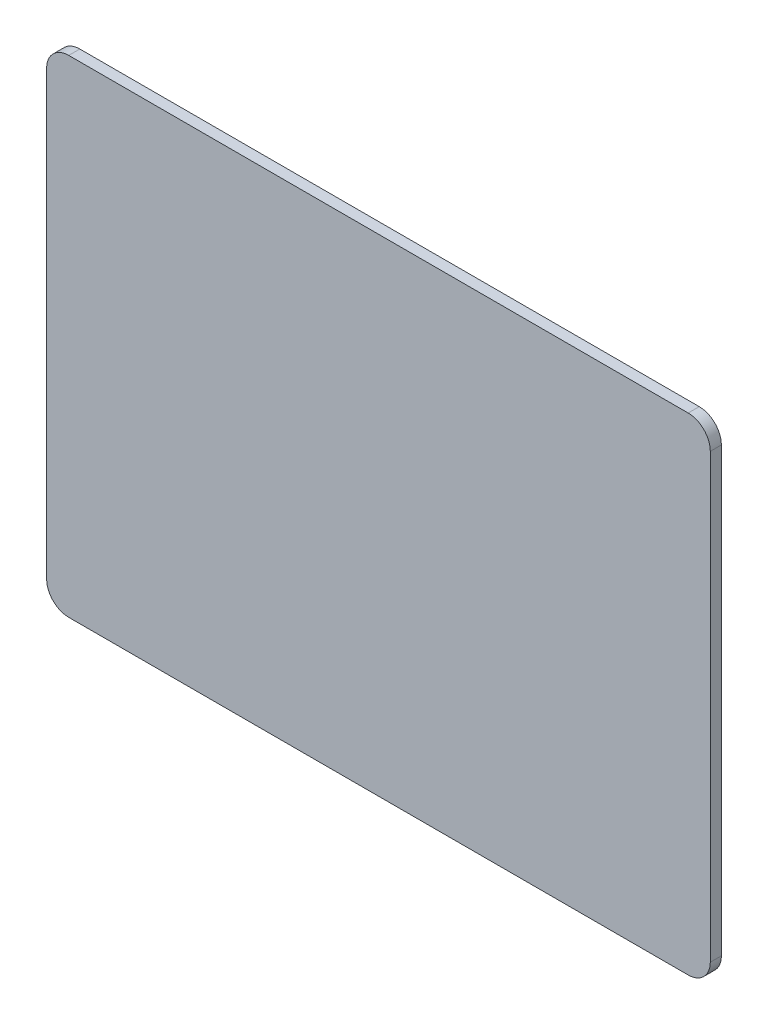
ISO-10303-21;
HEADER;
FILE_DESCRIPTION(('STEP AP214'),'2;1');
FILE_NAME('part.step','',(''),(''),'','','');
FILE_SCHEMA(('AUTOMOTIVE_DESIGN { 1 0 10303 214 1 1 1 1 }'));
ENDSEC;
DATA;
#1=APPLICATION_CONTEXT('core data for automotive mechanical design processes');
#2=APPLICATION_PROTOCOL_DEFINITION('international standard','automotive_design',2000,#1);
#3=PRODUCT_CONTEXT('',#1,'mechanical');
#4=PRODUCT('Part','Part','',(#3));
#5=PRODUCT_RELATED_PRODUCT_CATEGORY('part','',(#4));
#6=PRODUCT_DEFINITION_FORMATION('','',#4);
#7=PRODUCT_DEFINITION_CONTEXT('part definition',#1,'design');
#8=PRODUCT_DEFINITION('design','',#6,#7);
#9=PRODUCT_DEFINITION_SHAPE('','',#8);
#10=(LENGTH_UNIT() NAMED_UNIT(*) SI_UNIT(.MILLI.,.METRE.));
#11=(NAMED_UNIT(*) PLANE_ANGLE_UNIT() SI_UNIT($,.RADIAN.));
#12=(NAMED_UNIT(*) SI_UNIT($,.STERADIAN.) SOLID_ANGLE_UNIT());
#13=UNCERTAINTY_MEASURE_WITH_UNIT(LENGTH_MEASURE(1.E-05),#10,'distance_accuracy_value','');
#14=(GEOMETRIC_REPRESENTATION_CONTEXT(3) GLOBAL_UNCERTAINTY_ASSIGNED_CONTEXT((#13)) GLOBAL_UNIT_ASSIGNED_CONTEXT((#10,
#11,#12)) REPRESENTATION_CONTEXT('',''));
#15=CARTESIAN_POINT('',(0.,0.,0.));
#16=DIRECTION('',(0.,0.,1.));
#17=DIRECTION('',(1.,0.,0.));
#18=AXIS2_PLACEMENT_3D('',#15,#16,#17);
#19=CARTESIAN_POINT('',(-290.,100.,5.));
#20=DIRECTION('',(0.,0.,-1.));
#21=DIRECTION('',(-1.,0.,0.));
#22=AXIS2_PLACEMENT_3D('',#19,#20,#21);
#23=CYLINDRICAL_SURFACE('',#22,10.);
#24=CARTESIAN_POINT('',(-290.,100.,0.));
#25=DIRECTION('',(0.,0.,1.));
#26=DIRECTION('',(1.,0.,0.));
#27=AXIS2_PLACEMENT_3D('',#24,#25,#26);
#28=CIRCLE('',#27,10.);
#29=CARTESIAN_POINT('',(-290.,110.,0.));
#30=VERTEX_POINT('',#29);
#31=CARTESIAN_POINT('',(-300.,100.,0.));
#32=VERTEX_POINT('',#31);
#33=EDGE_CURVE('E131',#30,#32,#28,.T.);
#34=ORIENTED_EDGE('',*,*,#33,.T.);
#35=DIRECTION('',(0.,0.,-1.));
#36=VECTOR('',#35,1.);
#37=CARTESIAN_POINT('',(-300.,100.,5.));
#38=LINE('',#37,#36);
#39=CARTESIAN_POINT('',(-300.,100.,5.));
#40=VERTEX_POINT('',#39);
#41=EDGE_CURVE('E11',#40,#32,#38,.T.);
#42=ORIENTED_EDGE('',*,*,#41,.F.);
#43=CARTESIAN_POINT('',(-290.,100.,5.));
#44=DIRECTION('',(0.,0.,1.));
#45=DIRECTION('',(1.,0.,0.));
#46=AXIS2_PLACEMENT_3D('',#43,#44,#45);
#47=CIRCLE('',#46,10.);
#48=CARTESIAN_POINT('',(-290.,110.,5.));
#49=VERTEX_POINT('',#48);
#50=EDGE_CURVE('E145',#49,#40,#47,.T.);
#51=ORIENTED_EDGE('',*,*,#50,.F.);
#52=DIRECTION('',(0.,0.,-1.));
#53=VECTOR('',#52,1.);
#54=CARTESIAN_POINT('',(-290.,110.,5.));
#55=LINE('',#54,#53);
#56=EDGE_CURVE('E127',#49,#30,#55,.T.);
#57=ORIENTED_EDGE('',*,*,#56,.T.);
#58=EDGE_LOOP('',(#34,#42,#51,#57));
#59=FACE_BOUND('',#58,.T.);
#60=ADVANCED_FACE('F35',(#59),#23,.T.);
#61=CARTESIAN_POINT('',(-300.,100.,5.));
#62=DIRECTION('',(1.,0.,0.));
#63=DIRECTION('',(0.,0.,-1.));
#64=AXIS2_PLACEMENT_3D('',#61,#62,#63);
#65=PLANE('',#64);
#66=DIRECTION('',(0.,-1.,0.));
#67=VECTOR('',#66,1.);
#68=CARTESIAN_POINT('',(-300.,100.,0.));
#69=LINE('',#68,#67);
#70=CARTESIAN_POINT('',(-300.,-99.9999999999999,0.));
#71=VERTEX_POINT('',#70);
#72=EDGE_CURVE('E134',#32,#71,#69,.T.);
#73=ORIENTED_EDGE('',*,*,#72,.T.);
#74=DIRECTION('',(0.,0.,-1.));
#75=VECTOR('',#74,1.);
#76=CARTESIAN_POINT('',(-300.,-99.9999999999999,5.));
#77=LINE('',#76,#75);
#78=CARTESIAN_POINT('',(-300.,-99.9999999999999,5.));
#79=VERTEX_POINT('',#78);
#80=EDGE_CURVE('E43',#79,#71,#77,.T.);
#81=ORIENTED_EDGE('',*,*,#80,.F.);
#82=DIRECTION('',(0.,-1.,0.));
#83=VECTOR('',#82,1.);
#84=CARTESIAN_POINT('',(-300.,100.,5.));
#85=LINE('',#84,#83);
#86=EDGE_CURVE('E94',#40,#79,#85,.T.);
#87=ORIENTED_EDGE('',*,*,#86,.F.);
#88=ORIENTED_EDGE('',*,*,#41,.T.);
#89=EDGE_LOOP('',(#73,#81,#87,#88));
#90=FACE_BOUND('',#89,.T.);
#91=ADVANCED_FACE('F180',(#90),#65,.F.);
#92=CARTESIAN_POINT('',(-290.,-100.,5.));
#93=DIRECTION('',(0.,0.,-1.));
#94=DIRECTION('',(-1.,0.,0.));
#95=AXIS2_PLACEMENT_3D('',#92,#93,#94);
#96=CYLINDRICAL_SURFACE('',#95,10.);
#97=CARTESIAN_POINT('',(-290.,-100.,0.));
#98=DIRECTION('',(0.,0.,1.));
#99=DIRECTION('',(1.,0.,0.));
#100=AXIS2_PLACEMENT_3D('',#97,#98,#99);
#101=CIRCLE('',#100,10.);
#102=CARTESIAN_POINT('',(-290.,-110.,0.));
#103=VERTEX_POINT('',#102);
#104=EDGE_CURVE('E136',#71,#103,#101,.T.);
#105=ORIENTED_EDGE('',*,*,#104,.T.);
#106=DIRECTION('',(0.,0.,-1.));
#107=VECTOR('',#106,1.);
#108=CARTESIAN_POINT('',(-290.,-110.,5.));
#109=LINE('',#108,#107);
#110=CARTESIAN_POINT('',(-290.,-110.,5.));
#111=VERTEX_POINT('',#110);
#112=EDGE_CURVE('E152',#111,#103,#109,.T.);
#113=ORIENTED_EDGE('',*,*,#112,.F.);
#114=CARTESIAN_POINT('',(-290.,-100.,5.));
#115=DIRECTION('',(0.,0.,1.));
#116=DIRECTION('',(1.,0.,0.));
#117=AXIS2_PLACEMENT_3D('',#114,#115,#116);
#118=CIRCLE('',#117,10.);
#119=EDGE_CURVE('E160',#79,#111,#118,.T.);
#120=ORIENTED_EDGE('',*,*,#119,.F.);
#121=ORIENTED_EDGE('',*,*,#80,.T.);
#122=EDGE_LOOP('',(#105,#113,#120,#121));
#123=FACE_BOUND('',#122,.T.);
#124=ADVANCED_FACE('F158',(#123),#96,.T.);
#125=CARTESIAN_POINT('',(-290.,-110.,5.));
#126=DIRECTION('',(0.,1.,0.));
#127=DIRECTION('',(0.,0.,1.));
#128=AXIS2_PLACEMENT_3D('',#125,#126,#127);
#129=PLANE('',#128);
#130=DIRECTION('',(1.,0.,0.));
#131=VECTOR('',#130,1.);
#132=CARTESIAN_POINT('',(-290.,-110.,0.));
#133=LINE('',#132,#131);
#134=CARTESIAN_POINT('',(-9.99999999999997,-110.,0.));
#135=VERTEX_POINT('',#134);
#136=EDGE_CURVE('E138',#103,#135,#133,.T.);
#137=ORIENTED_EDGE('',*,*,#136,.T.);
#138=DIRECTION('',(0.,0.,-1.));
#139=VECTOR('',#138,1.);
#140=CARTESIAN_POINT('',(-9.99999999999997,-110.,5.));
#141=LINE('',#140,#139);
#142=CARTESIAN_POINT('',(-9.99999999999997,-110.,5.));
#143=VERTEX_POINT('',#142);
#144=EDGE_CURVE('E149',#143,#135,#141,.T.);
#145=ORIENTED_EDGE('',*,*,#144,.F.);
#146=DIRECTION('',(1.,0.,0.));
#147=VECTOR('',#146,1.);
#148=CARTESIAN_POINT('',(-290.,-110.,5.));
#149=LINE('',#148,#147);
#150=EDGE_CURVE('E172',#111,#143,#149,.T.);
#151=ORIENTED_EDGE('',*,*,#150,.F.);
#152=ORIENTED_EDGE('',*,*,#112,.T.);
#153=EDGE_LOOP('',(#137,#145,#151,#152));
#154=FACE_BOUND('',#153,.T.);
#155=ADVANCED_FACE('F168',(#154),#129,.F.);
#156=CARTESIAN_POINT('',(-9.99999999999997,-100.,5.));
#157=DIRECTION('',(0.,0.,-1.));
#158=DIRECTION('',(-1.,0.,0.));
#159=AXIS2_PLACEMENT_3D('',#156,#157,#158);
#160=CYLINDRICAL_SURFACE('',#159,10.);
#161=CARTESIAN_POINT('',(-9.99999999999997,-100.,0.));
#162=DIRECTION('',(0.,0.,1.));
#163=DIRECTION('',(1.,0.,0.));
#164=AXIS2_PLACEMENT_3D('',#161,#162,#163);
#165=CIRCLE('',#164,10.);
#166=CARTESIAN_POINT('',(0.,-100.,0.));
#167=VERTEX_POINT('',#166);
#168=EDGE_CURVE('E140',#135,#167,#165,.T.);
#169=ORIENTED_EDGE('',*,*,#168,.T.);
#170=DIRECTION('',(0.,0.,-1.));
#171=VECTOR('',#170,1.);
#172=CARTESIAN_POINT('',(0.,-100.,5.));
#173=LINE('',#172,#171);
#174=CARTESIAN_POINT('',(0.,-100.,5.));
#175=VERTEX_POINT('',#174);
#176=EDGE_CURVE('E122',#175,#167,#173,.T.);
#177=ORIENTED_EDGE('',*,*,#176,.F.);
#178=CARTESIAN_POINT('',(-9.99999999999997,-100.,5.));
#179=DIRECTION('',(0.,0.,1.));
#180=DIRECTION('',(1.,0.,0.));
#181=AXIS2_PLACEMENT_3D('',#178,#179,#180);
#182=CIRCLE('',#181,10.);
#183=EDGE_CURVE('E113',#143,#175,#182,.T.);
#184=ORIENTED_EDGE('',*,*,#183,.F.);
#185=ORIENTED_EDGE('',*,*,#144,.T.);
#186=EDGE_LOOP('',(#169,#177,#184,#185));
#187=FACE_BOUND('',#186,.T.);
#188=ADVANCED_FACE('F171',(#187),#160,.T.);
#189=CARTESIAN_POINT('',(0.,100.,5.));
#190=DIRECTION('',(-1.,0.,0.));
#191=DIRECTION('',(0.,0.,1.));
#192=AXIS2_PLACEMENT_3D('',#189,#190,#191);
#193=PLANE('',#192);
#194=DIRECTION('',(0.,1.,0.));
#195=VECTOR('',#194,1.);
#196=CARTESIAN_POINT('',(0.,100.,0.));
#197=LINE('',#196,#195);
#198=CARTESIAN_POINT('',(0.,100.,0.));
#199=VERTEX_POINT('',#198);
#200=EDGE_CURVE('E121',#167,#199,#197,.T.);
#201=ORIENTED_EDGE('',*,*,#200,.T.);
#202=DIRECTION('',(0.,0.,-1.));
#203=VECTOR('',#202,1.);
#204=CARTESIAN_POINT('',(0.,100.,5.));
#205=LINE('',#204,#203);
#206=CARTESIAN_POINT('',(0.,100.,5.));
#207=VERTEX_POINT('',#206);
#208=EDGE_CURVE('E118',#207,#199,#205,.T.);
#209=ORIENTED_EDGE('',*,*,#208,.F.);
#210=DIRECTION('',(0.,1.,0.));
#211=VECTOR('',#210,1.);
#212=CARTESIAN_POINT('',(0.,100.,5.));
#213=LINE('',#212,#211);
#214=EDGE_CURVE('E107',#175,#207,#213,.T.);
#215=ORIENTED_EDGE('',*,*,#214,.F.);
#216=ORIENTED_EDGE('',*,*,#176,.T.);
#217=EDGE_LOOP('',(#201,#209,#215,#216));
#218=FACE_BOUND('',#217,.T.);
#219=ADVANCED_FACE('F119',(#218),#193,.F.);
#220=CARTESIAN_POINT('',(-10.,100.,5.));
#221=DIRECTION('',(0.,0.,-1.));
#222=DIRECTION('',(-1.,0.,0.));
#223=AXIS2_PLACEMENT_3D('',#220,#221,#222);
#224=CYLINDRICAL_SURFACE('',#223,10.);
#225=CARTESIAN_POINT('',(-10.,100.,0.));
#226=DIRECTION('',(0.,0.,1.));
#227=DIRECTION('',(-1.,0.,0.));
#228=AXIS2_PLACEMENT_3D('',#225,#226,#227);
#229=CIRCLE('',#228,10.);
#230=CARTESIAN_POINT('',(-10.,110.,0.));
#231=VERTEX_POINT('',#230);
#232=EDGE_CURVE('E80',#199,#231,#229,.T.);
#233=ORIENTED_EDGE('',*,*,#232,.T.);
#234=DIRECTION('',(0.,0.,-1.));
#235=VECTOR('',#234,1.);
#236=CARTESIAN_POINT('',(-10.,110.,5.));
#237=LINE('',#236,#235);
#238=CARTESIAN_POINT('',(-10.,110.,5.));
#239=VERTEX_POINT('',#238);
#240=EDGE_CURVE('E123',#239,#231,#237,.T.);
#241=ORIENTED_EDGE('',*,*,#240,.F.);
#242=CARTESIAN_POINT('',(-10.,100.,5.));
#243=DIRECTION('',(0.,0.,1.));
#244=DIRECTION('',(-1.,0.,0.));
#245=AXIS2_PLACEMENT_3D('',#242,#243,#244);
#246=CIRCLE('',#245,10.);
#247=EDGE_CURVE('E111',#207,#239,#246,.T.);
#248=ORIENTED_EDGE('',*,*,#247,.F.);
#249=ORIENTED_EDGE('',*,*,#208,.T.);
#250=EDGE_LOOP('',(#233,#241,#248,#249));
#251=FACE_BOUND('',#250,.T.);
#252=ADVANCED_FACE('F125',(#251),#224,.T.);
#253=CARTESIAN_POINT('',(-290.,110.,5.));
#254=DIRECTION('',(0.,-1.,0.));
#255=DIRECTION('',(1.,0.,0.));
#256=AXIS2_PLACEMENT_3D('',#253,#254,#255);
#257=PLANE('',#256);
#258=DIRECTION('',(-1.,0.,0.));
#259=VECTOR('',#258,1.);
#260=CARTESIAN_POINT('',(-290.,110.,0.));
#261=LINE('',#260,#259);
#262=EDGE_CURVE('E86',#231,#30,#261,.T.);
#263=ORIENTED_EDGE('',*,*,#262,.T.);
#264=ORIENTED_EDGE('',*,*,#56,.F.);
#265=DIRECTION('',(-1.,0.,0.));
#266=VECTOR('',#265,1.);
#267=CARTESIAN_POINT('',(-290.,110.,5.));
#268=LINE('',#267,#266);
#269=EDGE_CURVE('E51',#239,#49,#268,.T.);
#270=ORIENTED_EDGE('',*,*,#269,.F.);
#271=ORIENTED_EDGE('',*,*,#240,.T.);
#272=EDGE_LOOP('',(#263,#264,#270,#271));
#273=FACE_BOUND('',#272,.T.);
#274=ADVANCED_FACE('F196',(#273),#257,.F.);
#275=CARTESIAN_POINT('',(-290.,100.,5.));
#276=DIRECTION('',(0.,0.,1.));
#277=DIRECTION('',(1.,0.,0.));
#278=AXIS2_PLACEMENT_3D('',#275,#276,#277);
#279=PLANE('',#278);
#280=ORIENTED_EDGE('',*,*,#50,.T.);
#281=ORIENTED_EDGE('',*,*,#86,.T.);
#282=ORIENTED_EDGE('',*,*,#119,.T.);
#283=ORIENTED_EDGE('',*,*,#150,.T.);
#284=ORIENTED_EDGE('',*,*,#183,.T.);
#285=ORIENTED_EDGE('',*,*,#214,.T.);
#286=ORIENTED_EDGE('',*,*,#247,.T.);
#287=ORIENTED_EDGE('',*,*,#269,.T.);
#288=EDGE_LOOP('',(#280,#281,#282,#283,#284,#285,#286,#287));
#289=FACE_BOUND('',#288,.T.);
#290=ADVANCED_FACE('F109',(#289),#279,.T.);
#291=CARTESIAN_POINT('',(-290.,100.,0.));
#292=DIRECTION('',(0.,0.,1.));
#293=DIRECTION('',(1.,0.,0.));
#294=AXIS2_PLACEMENT_3D('',#291,#292,#293);
#295=PLANE('',#294);
#296=ORIENTED_EDGE('',*,*,#33,.F.);
#297=ORIENTED_EDGE('',*,*,#262,.F.);
#298=ORIENTED_EDGE('',*,*,#232,.F.);
#299=ORIENTED_EDGE('',*,*,#200,.F.);
#300=ORIENTED_EDGE('',*,*,#168,.F.);
#301=ORIENTED_EDGE('',*,*,#136,.F.);
#302=ORIENTED_EDGE('',*,*,#104,.F.);
#303=ORIENTED_EDGE('',*,*,#72,.F.);
#304=EDGE_LOOP('',(#296,#297,#298,#299,#300,#301,#302,#303));
#305=FACE_BOUND('',#304,.T.);
#306=ADVANCED_FACE('F164',(#305),#295,.F.);
#307=CLOSED_SHELL('',(#60,#91,#124,#155,#188,#219,#252,#274,#290,#306));
#308=MANIFOLD_SOLID_BREP('B2',#307);
#309=ADVANCED_BREP_SHAPE_REPRESENTATION('',(#18,#308),#14);
#310=SHAPE_DEFINITION_REPRESENTATION(#9,#309);
ENDSEC;
END-ISO-10303-21;
